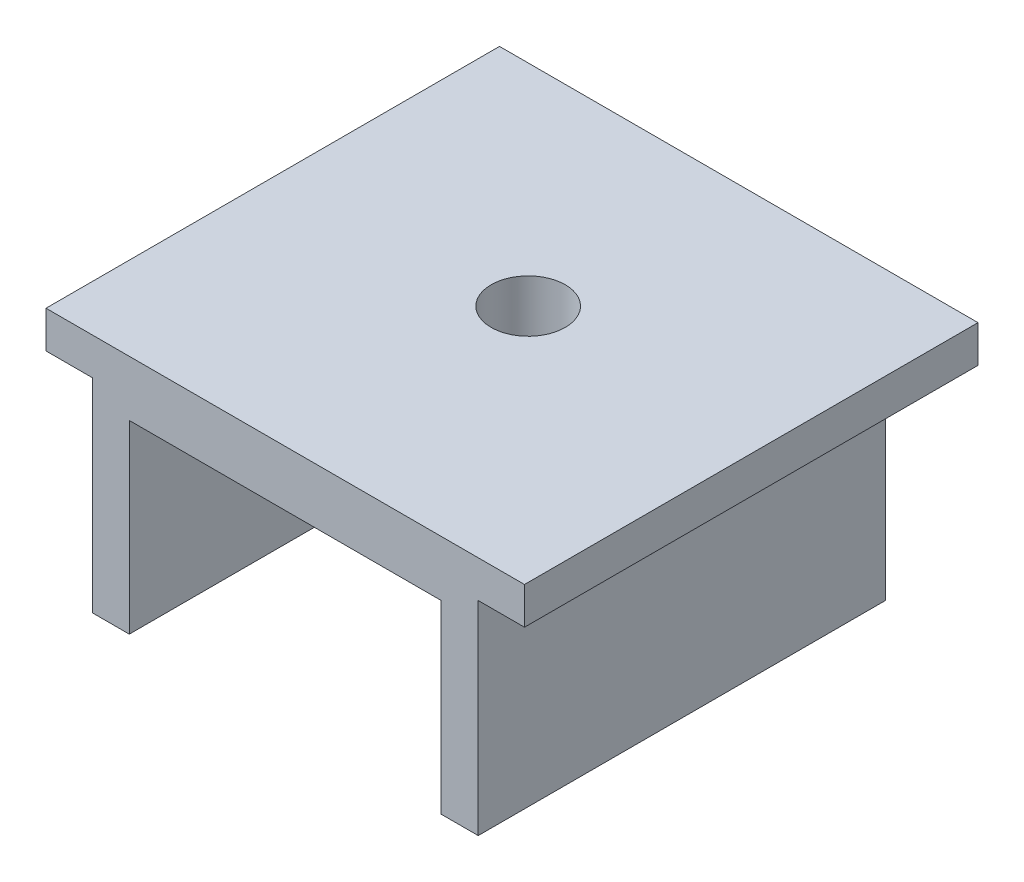
ISO-10303-21;
HEADER;
FILE_DESCRIPTION(('STEP AP214'),'2;1');
FILE_NAME('part.step','',(''),(''),'','','');
FILE_SCHEMA(('AUTOMOTIVE_DESIGN { 1 0 10303 214 1 1 1 1 }'));
ENDSEC;
DATA;
#1=APPLICATION_CONTEXT('core data for automotive mechanical design processes');
#2=APPLICATION_PROTOCOL_DEFINITION('international standard','automotive_design',2000,#1);
#3=PRODUCT_CONTEXT('',#1,'mechanical');
#4=PRODUCT('Part','Part','',(#3));
#5=PRODUCT_RELATED_PRODUCT_CATEGORY('part','',(#4));
#6=PRODUCT_DEFINITION_FORMATION('','',#4);
#7=PRODUCT_DEFINITION_CONTEXT('part definition',#1,'design');
#8=PRODUCT_DEFINITION('design','',#6,#7);
#9=PRODUCT_DEFINITION_SHAPE('','',#8);
#10=(LENGTH_UNIT() NAMED_UNIT(*) SI_UNIT(.MILLI.,.METRE.));
#11=(NAMED_UNIT(*) PLANE_ANGLE_UNIT() SI_UNIT($,.RADIAN.));
#12=(NAMED_UNIT(*) SI_UNIT($,.STERADIAN.) SOLID_ANGLE_UNIT());
#13=UNCERTAINTY_MEASURE_WITH_UNIT(LENGTH_MEASURE(1.E-05),#10,'distance_accuracy_value','');
#14=(GEOMETRIC_REPRESENTATION_CONTEXT(3) GLOBAL_UNCERTAINTY_ASSIGNED_CONTEXT((#13)) GLOBAL_UNIT_ASSIGNED_CONTEXT((#10,
#11,#12)) REPRESENTATION_CONTEXT('',''));
#15=CARTESIAN_POINT('',(0.,0.,0.));
#16=DIRECTION('',(0.,0.,1.));
#17=DIRECTION('',(1.,0.,0.));
#18=AXIS2_PLACEMENT_3D('',#15,#16,#17);
#19=CARTESIAN_POINT('',(20.85,0.,40.));
#20=DIRECTION('',(-1.,0.,0.));
#21=DIRECTION('',(0.,0.,1.));
#22=AXIS2_PLACEMENT_3D('',#19,#20,#21);
#23=PLANE('',#22);
#24=DIRECTION('',(0.,0.,-1.));
#25=VECTOR('',#24,1.);
#26=CARTESIAN_POINT('',(20.85,9.,40.));
#27=LINE('',#26,#25);
#28=CARTESIAN_POINT('',(20.85,9.,40.));
#29=VERTEX_POINT('',#28);
#30=CARTESIAN_POINT('',(20.85,9.,-4.));
#31=VERTEX_POINT('',#30);
#32=EDGE_CURVE('E169',#29,#31,#27,.T.);
#33=ORIENTED_EDGE('',*,*,#32,.F.);
#34=DIRECTION('',(0.,1.,0.));
#35=VECTOR('',#34,1.);
#36=CARTESIAN_POINT('',(20.85,0.,40.));
#37=LINE('',#36,#35);
#38=CARTESIAN_POINT('',(20.85,-13.,40.));
#39=VERTEX_POINT('',#38);
#40=EDGE_CURVE('E193',#39,#29,#37,.T.);
#41=ORIENTED_EDGE('',*,*,#40,.F.);
#42=DIRECTION('',(0.,0.,-1.));
#43=VECTOR('',#42,1.);
#44=CARTESIAN_POINT('',(20.85,-13.,40.));
#45=LINE('',#44,#43);
#46=CARTESIAN_POINT('',(20.85,-13.,-4.));
#47=VERTEX_POINT('',#46);
#48=EDGE_CURVE('E216',#39,#47,#45,.T.);
#49=ORIENTED_EDGE('',*,*,#48,.T.);
#50=DIRECTION('',(0.,1.,0.));
#51=VECTOR('',#50,1.);
#52=CARTESIAN_POINT('',(20.85,0.,-4.));
#53=LINE('',#52,#51);
#54=EDGE_CURVE('E175',#47,#31,#53,.T.);
#55=ORIENTED_EDGE('',*,*,#54,.T.);
#56=EDGE_LOOP('',(#33,#41,#49,#55));
#57=FACE_BOUND('',#56,.T.);
#58=ADVANCED_FACE('F35',(#57),#23,.F.);
#59=CARTESIAN_POINT('',(-20.85,0.,40.));
#60=DIRECTION('',(-1.,0.,0.));
#61=DIRECTION('',(0.,0.,1.));
#62=AXIS2_PLACEMENT_3D('',#59,#60,#61);
#63=PLANE('',#62);
#64=DIRECTION('',(0.,1.,0.));
#65=VECTOR('',#64,1.);
#66=CARTESIAN_POINT('',(-20.85,0.,40.));
#67=LINE('',#66,#65);
#68=CARTESIAN_POINT('',(-20.85,-13.,40.));
#69=VERTEX_POINT('',#68);
#70=CARTESIAN_POINT('',(-20.85,8.99999999999999,40.));
#71=VERTEX_POINT('',#70);
#72=EDGE_CURVE('E199',#69,#71,#67,.T.);
#73=ORIENTED_EDGE('',*,*,#72,.T.);
#74=DIRECTION('',(0.,0.,-1.));
#75=VECTOR('',#74,1.);
#76=CARTESIAN_POINT('',(-20.85,8.99999999999999,40.));
#77=LINE('',#76,#75);
#78=CARTESIAN_POINT('',(-20.85,8.99999999999999,-4.));
#79=VERTEX_POINT('',#78);
#80=EDGE_CURVE('E162',#71,#79,#77,.T.);
#81=ORIENTED_EDGE('',*,*,#80,.T.);
#82=DIRECTION('',(0.,1.,0.));
#83=VECTOR('',#82,1.);
#84=CARTESIAN_POINT('',(-20.85,0.,-4.));
#85=LINE('',#84,#83);
#86=CARTESIAN_POINT('',(-20.85,-13.,-4.));
#87=VERTEX_POINT('',#86);
#88=EDGE_CURVE('E178',#87,#79,#85,.T.);
#89=ORIENTED_EDGE('',*,*,#88,.F.);
#90=DIRECTION('',(0.,0.,-1.));
#91=VECTOR('',#90,1.);
#92=CARTESIAN_POINT('',(-20.85,-13.,40.));
#93=LINE('',#92,#91);
#94=EDGE_CURVE('E214',#69,#87,#93,.T.);
#95=ORIENTED_EDGE('',*,*,#94,.F.);
#96=EDGE_LOOP('',(#73,#81,#89,#95));
#97=FACE_BOUND('',#96,.T.);
#98=ADVANCED_FACE('F245',(#97),#63,.T.);
#99=CARTESIAN_POINT('',(0.,0.,-4.));
#100=DIRECTION('',(0.,0.,1.));
#101=DIRECTION('',(1.,0.,0.));
#102=AXIS2_PLACEMENT_3D('',#99,#100,#101);
#103=PLANE('',#102);
#104=DIRECTION('',(-1.,0.,0.));
#105=VECTOR('',#104,1.);
#106=CARTESIAN_POINT('',(0.,9.,-4.));
#107=LINE('',#106,#105);
#108=EDGE_CURVE('E11',#31,#79,#107,.T.);
#109=ORIENTED_EDGE('',*,*,#108,.F.);
#110=ORIENTED_EDGE('',*,*,#54,.F.);
#111=DIRECTION('',(-1.,0.,0.));
#112=VECTOR('',#111,1.);
#113=CARTESIAN_POINT('',(0.,-13.,-4.));
#114=LINE('',#113,#112);
#115=EDGE_CURVE('E172',#47,#87,#114,.T.);
#116=ORIENTED_EDGE('',*,*,#115,.T.);
#117=ORIENTED_EDGE('',*,*,#88,.T.);
#118=EDGE_LOOP('',(#109,#110,#116,#117));
#119=FACE_BOUND('',#118,.T.);
#120=ADVANCED_FACE('F248',(#119),#103,.F.);
#121=CARTESIAN_POINT('',(0.,7.,40.));
#122=DIRECTION('',(0.,1.,0.));
#123=DIRECTION('',(0.,0.,1.));
#124=AXIS2_PLACEMENT_3D('',#121,#122,#123);
#125=PLANE('',#124);
#126=CARTESIAN_POINT('',(0.,7.,13.75));
#127=DIRECTION('',(0.,-1.,0.));
#128=DIRECTION('',(0.,0.,-1.));
#129=AXIS2_PLACEMENT_3D('',#126,#127,#128);
#130=CIRCLE('',#129,4.);
#131=CARTESIAN_POINT('',(0.,7.,9.75));
#132=VERTEX_POINT('',#131);
#133=EDGE_CURVE('E152',#132,#132,#130,.T.);
#134=ORIENTED_EDGE('',*,*,#133,.F.);
#135=EDGE_LOOP('',(#134));
#136=FACE_BOUND('',#135,.T.);
#137=DIRECTION('',(1.,0.,0.));
#138=VECTOR('',#137,1.);
#139=CARTESIAN_POINT('',(0.,7.,0.));
#140=LINE('',#139,#138);
#141=CARTESIAN_POINT('',(-16.85,7.,0.));
#142=VERTEX_POINT('',#141);
#143=CARTESIAN_POINT('',(16.85,7.,0.));
#144=VERTEX_POINT('',#143);
#145=EDGE_CURVE('E181',#142,#144,#140,.T.);
#146=ORIENTED_EDGE('',*,*,#145,.T.);
#147=DIRECTION('',(0.,0.,-1.));
#148=VECTOR('',#147,1.);
#149=CARTESIAN_POINT('',(16.85,7.,40.));
#150=LINE('',#149,#148);
#151=CARTESIAN_POINT('',(16.85,7.,40.));
#152=VERTEX_POINT('',#151);
#153=EDGE_CURVE('E45',#152,#144,#150,.T.);
#154=ORIENTED_EDGE('',*,*,#153,.F.);
#155=DIRECTION('',(1.,0.,0.));
#156=VECTOR('',#155,1.);
#157=CARTESIAN_POINT('',(0.,7.,40.));
#158=LINE('',#157,#156);
#159=CARTESIAN_POINT('',(-16.85,7.,40.));
#160=VERTEX_POINT('',#159);
#161=EDGE_CURVE('E184',#160,#152,#158,.T.);
#162=ORIENTED_EDGE('',*,*,#161,.F.);
#163=DIRECTION('',(0.,0.,-1.));
#164=VECTOR('',#163,1.);
#165=CARTESIAN_POINT('',(-16.85,7.,40.));
#166=LINE('',#165,#164);
#167=EDGE_CURVE('E52',#160,#142,#166,.T.);
#168=ORIENTED_EDGE('',*,*,#167,.T.);
#169=EDGE_LOOP('',(#146,#154,#162,#168));
#170=FACE_BOUND('',#169,.T.);
#171=ADVANCED_FACE('F37',(#136,#170),#125,.F.);
#172=CARTESIAN_POINT('',(16.85,0.,40.));
#173=DIRECTION('',(1.,0.,0.));
#174=DIRECTION('',(0.,1.,0.));
#175=AXIS2_PLACEMENT_3D('',#172,#173,#174);
#176=PLANE('',#175);
#177=DIRECTION('',(0.,-1.,0.));
#178=VECTOR('',#177,1.);
#179=CARTESIAN_POINT('',(16.85,0.,0.));
#180=LINE('',#179,#178);
#181=CARTESIAN_POINT('',(16.85,-13.,0.));
#182=VERTEX_POINT('',#181);
#183=EDGE_CURVE('E206',#144,#182,#180,.T.);
#184=ORIENTED_EDGE('',*,*,#183,.T.);
#185=DIRECTION('',(0.,0.,-1.));
#186=VECTOR('',#185,1.);
#187=CARTESIAN_POINT('',(16.85,-13.,40.));
#188=LINE('',#187,#186);
#189=CARTESIAN_POINT('',(16.85,-13.,40.));
#190=VERTEX_POINT('',#189);
#191=EDGE_CURVE('E218',#190,#182,#188,.T.);
#192=ORIENTED_EDGE('',*,*,#191,.F.);
#193=DIRECTION('',(0.,-1.,0.));
#194=VECTOR('',#193,1.);
#195=CARTESIAN_POINT('',(16.85,0.,40.));
#196=LINE('',#195,#194);
#197=EDGE_CURVE('E187',#152,#190,#196,.T.);
#198=ORIENTED_EDGE('',*,*,#197,.F.);
#199=ORIENTED_EDGE('',*,*,#153,.T.);
#200=EDGE_LOOP('',(#184,#192,#198,#199));
#201=FACE_BOUND('',#200,.T.);
#202=ADVANCED_FACE('F224',(#201),#176,.F.);
#203=CARTESIAN_POINT('',(0.,13.,40.));
#204=DIRECTION('',(0.,-1.,0.));
#205=DIRECTION('',(1.,0.,0.));
#206=AXIS2_PLACEMENT_3D('',#203,#204,#205);
#207=PLANE('',#206);
#208=CARTESIAN_POINT('',(0.,13.,13.75));
#209=DIRECTION('',(0.,-1.,0.));
#210=DIRECTION('',(1.,0.,0.));
#211=AXIS2_PLACEMENT_3D('',#208,#209,#210);
#212=CIRCLE('',#211,4.);
#213=CARTESIAN_POINT('',(4.,13.,13.75));
#214=VERTEX_POINT('',#213);
#215=EDGE_CURVE('E39',#214,#214,#212,.T.);
#216=ORIENTED_EDGE('',*,*,#215,.T.);
#217=EDGE_LOOP('',(#216));
#218=FACE_BOUND('',#217,.T.);
#219=DIRECTION('',(-1.,0.,0.));
#220=VECTOR('',#219,1.);
#221=CARTESIAN_POINT('',(0.,13.,40.));
#222=LINE('',#221,#220);
#223=CARTESIAN_POINT('',(25.85,13.,40.));
#224=VERTEX_POINT('',#223);
#225=CARTESIAN_POINT('',(-25.85,13.,40.));
#226=VERTEX_POINT('',#225);
#227=EDGE_CURVE('E197',#224,#226,#222,.T.);
#228=ORIENTED_EDGE('',*,*,#227,.F.);
#229=DIRECTION('',(0.,0.,-1.));
#230=VECTOR('',#229,1.);
#231=CARTESIAN_POINT('',(25.85,13.,-9.));
#232=LINE('',#231,#230);
#233=CARTESIAN_POINT('',(25.85,13.,-9.));
#234=VERTEX_POINT('',#233);
#235=EDGE_CURVE('E158',#224,#234,#232,.T.);
#236=ORIENTED_EDGE('',*,*,#235,.T.);
#237=DIRECTION('',(-1.,0.,0.));
#238=VECTOR('',#237,1.);
#239=CARTESIAN_POINT('',(-25.85,13.,-9.));
#240=LINE('',#239,#238);
#241=CARTESIAN_POINT('',(-25.85,13.,-9.));
#242=VERTEX_POINT('',#241);
#243=EDGE_CURVE('E126',#234,#242,#240,.T.);
#244=ORIENTED_EDGE('',*,*,#243,.T.);
#245=DIRECTION('',(0.,0.,1.));
#246=VECTOR('',#245,1.);
#247=CARTESIAN_POINT('',(-25.85,13.,-9.));
#248=LINE('',#247,#246);
#249=EDGE_CURVE('E147',#242,#226,#248,.T.);
#250=ORIENTED_EDGE('',*,*,#249,.T.);
#251=EDGE_LOOP('',(#228,#236,#244,#250));
#252=FACE_BOUND('',#251,.T.);
#253=ADVANCED_FACE('F252',(#218,#252),#207,.F.);
#254=CARTESIAN_POINT('',(0.,-13.,40.));
#255=DIRECTION('',(0.,-1.,0.));
#256=DIRECTION('',(1.,0.,0.));
#257=AXIS2_PLACEMENT_3D('',#254,#255,#256);
#258=PLANE('',#257);
#259=ORIENTED_EDGE('',*,*,#94,.T.);
#260=ORIENTED_EDGE('',*,*,#115,.F.);
#261=ORIENTED_EDGE('',*,*,#48,.F.);
#262=DIRECTION('',(-1.,0.,0.));
#263=VECTOR('',#262,1.);
#264=CARTESIAN_POINT('',(0.,-13.,40.));
#265=LINE('',#264,#263);
#266=EDGE_CURVE('E190',#39,#190,#265,.T.);
#267=ORIENTED_EDGE('',*,*,#266,.T.);
#268=ORIENTED_EDGE('',*,*,#191,.T.);
#269=DIRECTION('',(-1.,0.,0.));
#270=VECTOR('',#269,1.);
#271=CARTESIAN_POINT('',(0.,-13.,0.));
#272=LINE('',#271,#270);
#273=CARTESIAN_POINT('',(-16.85,-13.,0.));
#274=VERTEX_POINT('',#273);
#275=EDGE_CURVE('E171',#182,#274,#272,.T.);
#276=ORIENTED_EDGE('',*,*,#275,.T.);
#277=DIRECTION('',(0.,0.,-1.));
#278=VECTOR('',#277,1.);
#279=CARTESIAN_POINT('',(-16.85,-13.,40.));
#280=LINE('',#279,#278);
#281=CARTESIAN_POINT('',(-16.85,-13.,40.));
#282=VERTEX_POINT('',#281);
#283=EDGE_CURVE('E211',#282,#274,#280,.T.);
#284=ORIENTED_EDGE('',*,*,#283,.F.);
#285=EDGE_CURVE('E194',#282,#69,#265,.T.);
#286=ORIENTED_EDGE('',*,*,#285,.T.);
#287=EDGE_LOOP('',(#259,#260,#261,#267,#268,#276,#284,#286));
#288=FACE_BOUND('',#287,.T.);
#289=ADVANCED_FACE('F231',(#288),#258,.T.);
#290=CARTESIAN_POINT('',(-16.85,0.,40.));
#291=DIRECTION('',(1.,0.,0.));
#292=DIRECTION('',(0.,1.,0.));
#293=AXIS2_PLACEMENT_3D('',#290,#291,#292);
#294=PLANE('',#293);
#295=DIRECTION('',(0.,-1.,0.));
#296=VECTOR('',#295,1.);
#297=CARTESIAN_POINT('',(-16.85,0.,0.));
#298=LINE('',#297,#296);
#299=EDGE_CURVE('E188',#142,#274,#298,.T.);
#300=ORIENTED_EDGE('',*,*,#299,.F.);
#301=ORIENTED_EDGE('',*,*,#167,.F.);
#302=DIRECTION('',(0.,-1.,0.));
#303=VECTOR('',#302,1.);
#304=CARTESIAN_POINT('',(-16.85,0.,40.));
#305=LINE('',#304,#303);
#306=EDGE_CURVE('E202',#160,#282,#305,.T.);
#307=ORIENTED_EDGE('',*,*,#306,.T.);
#308=ORIENTED_EDGE('',*,*,#283,.T.);
#309=EDGE_LOOP('',(#300,#301,#307,#308));
#310=FACE_BOUND('',#309,.T.);
#311=ADVANCED_FACE('F241',(#310),#294,.T.);
#312=CARTESIAN_POINT('',(0.,0.,40.));
#313=DIRECTION('',(0.,0.,1.));
#314=DIRECTION('',(1.,0.,0.));
#315=AXIS2_PLACEMENT_3D('',#312,#313,#314);
#316=PLANE('',#315);
#317=ORIENTED_EDGE('',*,*,#227,.T.);
#318=DIRECTION('',(0.,1.,0.));
#319=VECTOR('',#318,1.);
#320=CARTESIAN_POINT('',(-25.85,8.99999999999999,40.));
#321=LINE('',#320,#319);
#322=CARTESIAN_POINT('',(-25.85,8.99999999999999,40.));
#323=VERTEX_POINT('',#322);
#324=EDGE_CURVE('E163',#323,#226,#321,.T.);
#325=ORIENTED_EDGE('',*,*,#324,.F.);
#326=DIRECTION('',(1.,0.,0.));
#327=VECTOR('',#326,1.);
#328=CARTESIAN_POINT('',(-25.85,8.99999999999999,40.));
#329=LINE('',#328,#327);
#330=EDGE_CURVE('E132',#323,#71,#329,.T.);
#331=ORIENTED_EDGE('',*,*,#330,.T.);
#332=ORIENTED_EDGE('',*,*,#72,.F.);
#333=ORIENTED_EDGE('',*,*,#285,.F.);
#334=ORIENTED_EDGE('',*,*,#306,.F.);
#335=ORIENTED_EDGE('',*,*,#161,.T.);
#336=ORIENTED_EDGE('',*,*,#197,.T.);
#337=ORIENTED_EDGE('',*,*,#266,.F.);
#338=ORIENTED_EDGE('',*,*,#40,.T.);
#339=CARTESIAN_POINT('',(25.85,9.,40.));
#340=VERTEX_POINT('',#339);
#341=EDGE_CURVE('E155',#29,#340,#329,.T.);
#342=ORIENTED_EDGE('',*,*,#341,.T.);
#343=DIRECTION('',(0.,1.,0.));
#344=VECTOR('',#343,1.);
#345=CARTESIAN_POINT('',(25.85,9.,40.));
#346=LINE('',#345,#344);
#347=EDGE_CURVE('E146',#340,#224,#346,.T.);
#348=ORIENTED_EDGE('',*,*,#347,.T.);
#349=EDGE_LOOP('',(#317,#325,#331,#332,#333,#334,#335,#336,#337,#338,#342,#348));
#350=FACE_BOUND('',#349,.T.);
#351=ADVANCED_FACE('F236',(#350),#316,.T.);
#352=CARTESIAN_POINT('',(0.,0.,0.));
#353=DIRECTION('',(0.,0.,1.));
#354=DIRECTION('',(1.,0.,0.));
#355=AXIS2_PLACEMENT_3D('',#352,#353,#354);
#356=PLANE('',#355);
#357=ORIENTED_EDGE('',*,*,#145,.F.);
#358=ORIENTED_EDGE('',*,*,#299,.T.);
#359=ORIENTED_EDGE('',*,*,#275,.F.);
#360=ORIENTED_EDGE('',*,*,#183,.F.);
#361=EDGE_LOOP('',(#357,#358,#359,#360));
#362=FACE_BOUND('',#361,.T.);
#363=ADVANCED_FACE('F228',(#362),#356,.T.);
#364=CARTESIAN_POINT('',(0.,9.,0.));
#365=DIRECTION('',(0.,1.,0.));
#366=DIRECTION('',(-1.,0.,0.));
#367=AXIS2_PLACEMENT_3D('',#364,#365,#366);
#368=PLANE('',#367);
#369=ORIENTED_EDGE('',*,*,#341,.F.);
#370=ORIENTED_EDGE('',*,*,#32,.T.);
#371=ORIENTED_EDGE('',*,*,#108,.T.);
#372=ORIENTED_EDGE('',*,*,#80,.F.);
#373=ORIENTED_EDGE('',*,*,#330,.F.);
#374=DIRECTION('',(0.,0.,1.));
#375=VECTOR('',#374,1.);
#376=CARTESIAN_POINT('',(-25.85,8.99999999999999,-9.));
#377=LINE('',#376,#375);
#378=CARTESIAN_POINT('',(-25.85,8.99999999999999,-9.));
#379=VERTEX_POINT('',#378);
#380=EDGE_CURVE('E141',#379,#323,#377,.T.);
#381=ORIENTED_EDGE('',*,*,#380,.F.);
#382=DIRECTION('',(-1.,0.,0.));
#383=VECTOR('',#382,1.);
#384=CARTESIAN_POINT('',(-25.85,8.99999999999999,-9.));
#385=LINE('',#384,#383);
#386=CARTESIAN_POINT('',(25.85,9.,-9.));
#387=VERTEX_POINT('',#386);
#388=EDGE_CURVE('E124',#387,#379,#385,.T.);
#389=ORIENTED_EDGE('',*,*,#388,.F.);
#390=DIRECTION('',(0.,0.,-1.));
#391=VECTOR('',#390,1.);
#392=CARTESIAN_POINT('',(25.85,9.,-9.));
#393=LINE('',#392,#391);
#394=EDGE_CURVE('E138',#340,#387,#393,.T.);
#395=ORIENTED_EDGE('',*,*,#394,.F.);
#396=EDGE_LOOP('',(#369,#370,#371,#372,#373,#381,#389,#395));
#397=FACE_BOUND('',#396,.T.);
#398=ADVANCED_FACE('F137',(#397),#368,.F.);
#399=CARTESIAN_POINT('',(25.85,9.,-9.));
#400=DIRECTION('',(1.,0.,0.));
#401=DIRECTION('',(0.,1.,0.));
#402=AXIS2_PLACEMENT_3D('',#399,#400,#401);
#403=PLANE('',#402);
#404=ORIENTED_EDGE('',*,*,#235,.F.);
#405=ORIENTED_EDGE('',*,*,#347,.F.);
#406=ORIENTED_EDGE('',*,*,#394,.T.);
#407=DIRECTION('',(0.,1.,0.));
#408=VECTOR('',#407,1.);
#409=CARTESIAN_POINT('',(25.85,9.,-9.));
#410=LINE('',#409,#408);
#411=EDGE_CURVE('E121',#387,#234,#410,.T.);
#412=ORIENTED_EDGE('',*,*,#411,.T.);
#413=EDGE_LOOP('',(#404,#405,#406,#412));
#414=FACE_BOUND('',#413,.T.);
#415=ADVANCED_FACE('F144',(#414),#403,.T.);
#416=CARTESIAN_POINT('',(-25.85,8.99999999999999,-9.));
#417=DIRECTION('',(-1.,0.,0.));
#418=DIRECTION('',(0.,-1.,0.));
#419=AXIS2_PLACEMENT_3D('',#416,#417,#418);
#420=PLANE('',#419);
#421=ORIENTED_EDGE('',*,*,#249,.F.);
#422=DIRECTION('',(0.,1.,0.));
#423=VECTOR('',#422,1.);
#424=CARTESIAN_POINT('',(-25.85,8.99999999999999,-9.));
#425=LINE('',#424,#423);
#426=EDGE_CURVE('E131',#379,#242,#425,.T.);
#427=ORIENTED_EDGE('',*,*,#426,.F.);
#428=ORIENTED_EDGE('',*,*,#380,.T.);
#429=ORIENTED_EDGE('',*,*,#324,.T.);
#430=EDGE_LOOP('',(#421,#427,#428,#429));
#431=FACE_BOUND('',#430,.T.);
#432=ADVANCED_FACE('F255',(#431),#420,.T.);
#433=CARTESIAN_POINT('',(-25.85,8.99999999999999,-9.));
#434=DIRECTION('',(0.,0.,-1.));
#435=DIRECTION('',(-1.,0.,0.));
#436=AXIS2_PLACEMENT_3D('',#433,#434,#435);
#437=PLANE('',#436);
#438=ORIENTED_EDGE('',*,*,#243,.F.);
#439=ORIENTED_EDGE('',*,*,#411,.F.);
#440=ORIENTED_EDGE('',*,*,#388,.T.);
#441=ORIENTED_EDGE('',*,*,#426,.T.);
#442=EDGE_LOOP('',(#438,#439,#440,#441));
#443=FACE_BOUND('',#442,.T.);
#444=ADVANCED_FACE('F123',(#443),#437,.T.);
#445=CARTESIAN_POINT('',(0.,15.,13.75));
#446=DIRECTION('',(0.,-1.,0.));
#447=DIRECTION('',(0.,0.,-1.));
#448=AXIS2_PLACEMENT_3D('',#445,#446,#447);
#449=CYLINDRICAL_SURFACE('',#448,4.);
#450=ORIENTED_EDGE('',*,*,#133,.T.);
#451=EDGE_LOOP('',(#450));
#452=FACE_BOUND('',#451,.T.);
#453=ORIENTED_EDGE('',*,*,#215,.F.);
#454=EDGE_LOOP('',(#453));
#455=FACE_BOUND('',#454,.T.);
#456=ADVANCED_FACE('F262',(#452,#455),#449,.F.);
#457=CLOSED_SHELL('',(#58,#98,#120,#171,#202,#253,#289,#311,#351,#363,#398,#415,#432,#444,#456));
#458=MANIFOLD_SOLID_BREP('B2',#457);
#459=ADVANCED_BREP_SHAPE_REPRESENTATION('',(#18,#458),#14);
#460=SHAPE_DEFINITION_REPRESENTATION(#9,#459);
ENDSEC;
END-ISO-10303-21;
